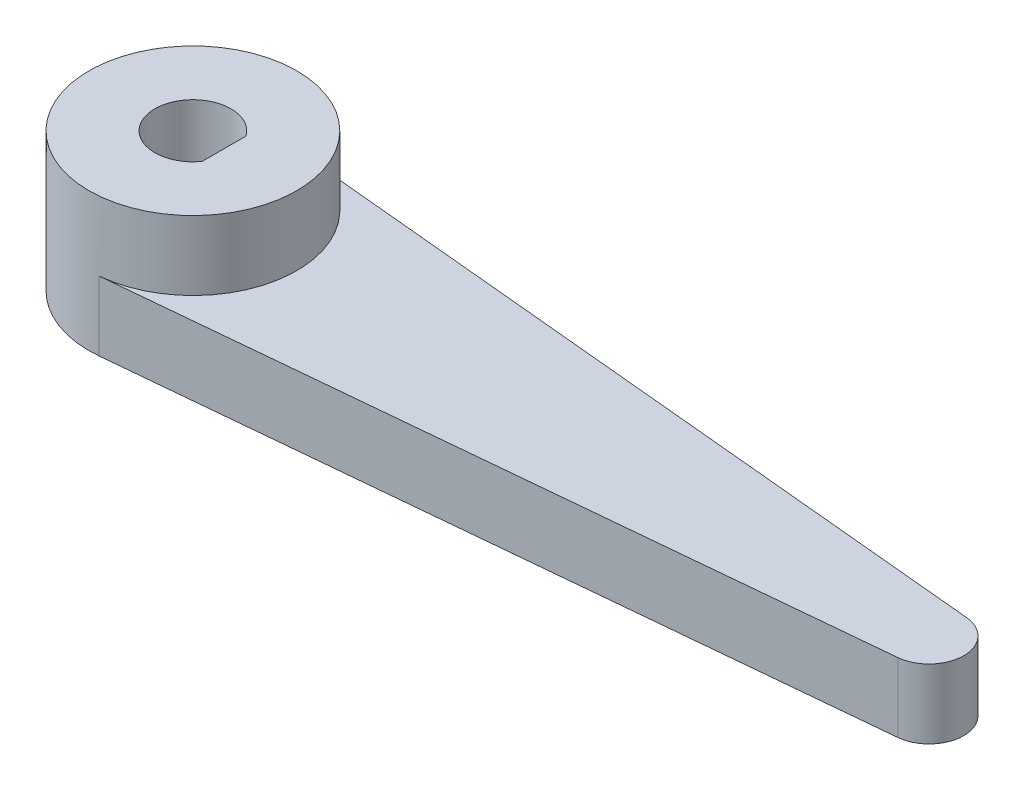
ISO-10303-21;
HEADER;
FILE_DESCRIPTION(('STEP AP214'),'2;1');
FILE_NAME('part.step','',(''),(''),'','','');
FILE_SCHEMA(('AUTOMOTIVE_DESIGN { 1 0 10303 214 1 1 1 1 }'));
ENDSEC;
DATA;
#1=APPLICATION_CONTEXT('core data for automotive mechanical design processes');
#2=APPLICATION_PROTOCOL_DEFINITION('international standard','automotive_design',2000,#1);
#3=PRODUCT_CONTEXT('',#1,'mechanical');
#4=PRODUCT('Part','Part','',(#3));
#5=PRODUCT_RELATED_PRODUCT_CATEGORY('part','',(#4));
#6=PRODUCT_DEFINITION_FORMATION('','',#4);
#7=PRODUCT_DEFINITION_CONTEXT('part definition',#1,'design');
#8=PRODUCT_DEFINITION('design','',#6,#7);
#9=PRODUCT_DEFINITION_SHAPE('','',#8);
#10=(LENGTH_UNIT() NAMED_UNIT(*) SI_UNIT(.MILLI.,.METRE.));
#11=(NAMED_UNIT(*) PLANE_ANGLE_UNIT() SI_UNIT($,.RADIAN.));
#12=(NAMED_UNIT(*) SI_UNIT($,.STERADIAN.) SOLID_ANGLE_UNIT());
#13=UNCERTAINTY_MEASURE_WITH_UNIT(LENGTH_MEASURE(1.E-05),#10,'distance_accuracy_value','');
#14=(GEOMETRIC_REPRESENTATION_CONTEXT(3) GLOBAL_UNCERTAINTY_ASSIGNED_CONTEXT((#13)) GLOBAL_UNIT_ASSIGNED_CONTEXT((#10,
#11,#12)) REPRESENTATION_CONTEXT('',''));
#15=CARTESIAN_POINT('',(0.,0.,0.));
#16=DIRECTION('',(0.,0.,1.));
#17=DIRECTION('',(1.,0.,0.));
#18=AXIS2_PLACEMENT_3D('',#15,#16,#17);
#19=CARTESIAN_POINT('',(0.,5.,0.));
#20=DIRECTION('',(0.,-1.,0.));
#21=DIRECTION('',(0.,0.,-1.));
#22=AXIS2_PLACEMENT_3D('',#19,#20,#21);
#23=CYLINDRICAL_SURFACE('',#22,7.5);
#24=CARTESIAN_POINT('',(0.,0.,0.));
#25=DIRECTION('',(0.,1.,0.));
#26=DIRECTION('',(0.,0.,1.));
#27=AXIS2_PLACEMENT_3D('',#24,#25,#26);
#28=CIRCLE('',#27,7.5);
#29=CARTESIAN_POINT('',(0.705615188968486,0.,-7.46673336909099));
#30=VERTEX_POINT('',#29);
#31=CARTESIAN_POINT('',(0.705615188968486,0.,7.46673336909099));
#32=VERTEX_POINT('',#31);
#33=EDGE_CURVE('E108',#30,#32,#28,.T.);
#34=ORIENTED_EDGE('',*,*,#33,.T.);
#35=DIRECTION('',(0.,-1.,0.));
#36=VECTOR('',#35,1.);
#37=CARTESIAN_POINT('',(0.705615188968486,5.,7.46673336909099));
#38=LINE('',#37,#36);
#39=CARTESIAN_POINT('',(0.705615188968486,5.,7.466733369091));
#40=VERTEX_POINT('',#39);
#41=EDGE_CURVE('E11',#40,#32,#38,.T.);
#42=ORIENTED_EDGE('',*,*,#41,.F.);
#43=CARTESIAN_POINT('',(0.,5.,0.));
#44=DIRECTION('',(0.,1.,0.));
#45=DIRECTION('',(0.,0.,1.));
#46=AXIS2_PLACEMENT_3D('',#43,#44,#45);
#47=CIRCLE('',#46,7.5);
#48=CARTESIAN_POINT('',(0.705615188968486,5.,-7.46673336909099));
#49=VERTEX_POINT('',#48);
#50=EDGE_CURVE('E103',#40,#49,#47,.T.);
#51=ORIENTED_EDGE('',*,*,#50,.T.);
#52=DIRECTION('',(0.,-1.,0.));
#53=VECTOR('',#52,1.);
#54=CARTESIAN_POINT('',(0.705615188968486,5.,-7.46673336909099));
#55=LINE('',#54,#53);
#56=EDGE_CURVE('E118',#49,#30,#55,.T.);
#57=ORIENTED_EDGE('',*,*,#56,.T.);
#58=EDGE_LOOP('',(#34,#42,#51,#57));
#59=FACE_BOUND('',#58,.T.);
#60=CARTESIAN_POINT('',(0.,10.,0.));
#61=DIRECTION('',(0.,1.,0.));
#62=DIRECTION('',(0.,0.,1.));
#63=AXIS2_PLACEMENT_3D('',#60,#61,#62);
#64=CIRCLE('',#63,7.5);
#65=CARTESIAN_POINT('',(0.,10.,7.5));
#66=VERTEX_POINT('',#65);
#67=EDGE_CURVE('E105',#66,#66,#64,.T.);
#68=ORIENTED_EDGE('',*,*,#67,.F.);
#69=EDGE_LOOP('',(#68));
#70=FACE_BOUND('',#69,.T.);
#71=ADVANCED_FACE('F35',(#59,#70),#23,.T.);
#72=CARTESIAN_POINT('',(0.705615188968486,5.,7.46673336909099));
#73=DIRECTION('',(-0.0940820251957981,0.,-0.995564449212133));
#74=DIRECTION('',(-0.995564449212133,0.,0.0940820251957981));
#75=AXIS2_PLACEMENT_3D('',#72,#73,#74);
#76=PLANE('',#75);
#77=DIRECTION('',(0.995564449212133,0.,-0.0940820251957981));
#78=VECTOR('',#77,1.);
#79=CARTESIAN_POINT('',(0.705615188968486,0.,7.46673336909099));
#80=LINE('',#79,#78);
#81=CARTESIAN_POINT('',(53.3803195478689,0.,2.48891112303033));
#82=VERTEX_POINT('',#81);
#83=EDGE_CURVE('E121',#32,#82,#80,.T.);
#84=ORIENTED_EDGE('',*,*,#83,.T.);
#85=DIRECTION('',(0.,-1.,0.));
#86=VECTOR('',#85,1.);
#87=CARTESIAN_POINT('',(53.3803195478689,5.,2.48891112303033));
#88=LINE('',#87,#86);
#89=CARTESIAN_POINT('',(53.3803195478689,5.,2.48891112303033));
#90=VERTEX_POINT('',#89);
#91=EDGE_CURVE('E42',#90,#82,#88,.T.);
#92=ORIENTED_EDGE('',*,*,#91,.F.);
#93=DIRECTION('',(0.995564449212133,0.,-0.0940820251957981));
#94=VECTOR('',#93,1.);
#95=CARTESIAN_POINT('',(0.705615188968486,5.,7.46673336909099));
#96=LINE('',#95,#94);
#97=EDGE_CURVE('E111',#40,#90,#96,.T.);
#98=ORIENTED_EDGE('',*,*,#97,.F.);
#99=ORIENTED_EDGE('',*,*,#41,.T.);
#100=EDGE_LOOP('',(#84,#92,#98,#99));
#101=FACE_BOUND('',#100,.T.);
#102=ADVANCED_FACE('F150',(#101),#76,.F.);
#103=CARTESIAN_POINT('',(53.1451144848794,5.,0.));
#104=DIRECTION('',(0.,-1.,0.));
#105=DIRECTION('',(0.,0.,-1.));
#106=AXIS2_PLACEMENT_3D('',#103,#104,#105);
#107=CYLINDRICAL_SURFACE('',#106,2.5);
#108=CARTESIAN_POINT('',(53.1451144848794,0.,0.));
#109=DIRECTION('',(0.,1.,0.));
#110=DIRECTION('',(0.,0.,1.));
#111=AXIS2_PLACEMENT_3D('',#108,#109,#110);
#112=CIRCLE('',#111,2.5);
#113=CARTESIAN_POINT('',(53.3803195478689,0.,-2.48891112303033));
#114=VERTEX_POINT('',#113);
#115=EDGE_CURVE('E123',#82,#114,#112,.T.);
#116=ORIENTED_EDGE('',*,*,#115,.T.);
#117=DIRECTION('',(0.,-1.,0.));
#118=VECTOR('',#117,1.);
#119=CARTESIAN_POINT('',(53.3803195478689,5.,-2.48891112303033));
#120=LINE('',#119,#118);
#121=CARTESIAN_POINT('',(53.3803195478689,5.,-2.48891112303033));
#122=VERTEX_POINT('',#121);
#123=EDGE_CURVE('E128',#122,#114,#120,.T.);
#124=ORIENTED_EDGE('',*,*,#123,.F.);
#125=CARTESIAN_POINT('',(53.1451144848794,5.,0.));
#126=DIRECTION('',(0.,1.,0.));
#127=DIRECTION('',(0.,0.,1.));
#128=AXIS2_PLACEMENT_3D('',#125,#126,#127);
#129=CIRCLE('',#128,2.5);
#130=EDGE_CURVE('E113',#90,#122,#129,.T.);
#131=ORIENTED_EDGE('',*,*,#130,.F.);
#132=ORIENTED_EDGE('',*,*,#91,.T.);
#133=EDGE_LOOP('',(#116,#124,#131,#132));
#134=FACE_BOUND('',#133,.T.);
#135=ADVANCED_FACE('F135',(#134),#107,.T.);
#136=CARTESIAN_POINT('',(0.705615188968486,5.,-7.46673336909099));
#137=DIRECTION('',(-0.0940820251957982,0.,0.995564449212133));
#138=DIRECTION('',(0.995564449212133,0.,0.0940820251957982));
#139=AXIS2_PLACEMENT_3D('',#136,#137,#138);
#140=PLANE('',#139);
#141=DIRECTION('',(-0.995564449212133,0.,-0.0940820251957982));
#142=VECTOR('',#141,1.);
#143=CARTESIAN_POINT('',(0.705615188968486,0.,-7.46673336909099));
#144=LINE('',#143,#142);
#145=EDGE_CURVE('E114',#114,#30,#144,.T.);
#146=ORIENTED_EDGE('',*,*,#145,.T.);
#147=ORIENTED_EDGE('',*,*,#56,.F.);
#148=DIRECTION('',(-0.995564449212133,0.,-0.0940820251957982));
#149=VECTOR('',#148,1.);
#150=CARTESIAN_POINT('',(0.705615188968486,5.,-7.46673336909099));
#151=LINE('',#150,#149);
#152=EDGE_CURVE('E116',#122,#49,#151,.T.);
#153=ORIENTED_EDGE('',*,*,#152,.F.);
#154=ORIENTED_EDGE('',*,*,#123,.T.);
#155=EDGE_LOOP('',(#146,#147,#153,#154));
#156=FACE_BOUND('',#155,.T.);
#157=ADVANCED_FACE('F143',(#156),#140,.F.);
#158=CARTESIAN_POINT('',(0.,5.,0.));
#159=DIRECTION('',(0.,1.,0.));
#160=DIRECTION('',(0.,0.,1.));
#161=AXIS2_PLACEMENT_3D('',#158,#159,#160);
#162=PLANE('',#161);
#163=ORIENTED_EDGE('',*,*,#50,.F.);
#164=ORIENTED_EDGE('',*,*,#97,.T.);
#165=ORIENTED_EDGE('',*,*,#130,.T.);
#166=ORIENTED_EDGE('',*,*,#152,.T.);
#167=EDGE_LOOP('',(#163,#164,#165,#166));
#168=FACE_BOUND('',#167,.T.);
#169=ADVANCED_FACE('F149',(#168),#162,.T.);
#170=CARTESIAN_POINT('',(0.,0.,0.));
#171=DIRECTION('',(0.,1.,0.));
#172=DIRECTION('',(0.,0.,1.));
#173=AXIS2_PLACEMENT_3D('',#170,#171,#172);
#174=PLANE('',#173);
#175=DIRECTION('',(0.,0.,-1.));
#176=VECTOR('',#175,1.);
#177=CARTESIAN_POINT('',(2.25,0.,-1.58113883008419));
#178=LINE('',#177,#176);
#179=CARTESIAN_POINT('',(2.25,0.,1.58113883008419));
#180=VERTEX_POINT('',#179);
#181=CARTESIAN_POINT('',(2.25,0.,-1.58113883008419));
#182=VERTEX_POINT('',#181);
#183=EDGE_CURVE('E90',#180,#182,#178,.T.);
#184=ORIENTED_EDGE('',*,*,#183,.T.);
#185=CARTESIAN_POINT('',(0.,0.,0.));
#186=DIRECTION('',(0.,1.,0.));
#187=DIRECTION('',(0.,0.,1.));
#188=AXIS2_PLACEMENT_3D('',#185,#186,#187);
#189=CIRCLE('',#188,2.75);
#190=EDGE_CURVE('E49',#182,#180,#189,.T.);
#191=ORIENTED_EDGE('',*,*,#190,.T.);
#192=EDGE_LOOP('',(#184,#191));
#193=FACE_BOUND('',#192,.T.);
#194=ORIENTED_EDGE('',*,*,#33,.F.);
#195=ORIENTED_EDGE('',*,*,#145,.F.);
#196=ORIENTED_EDGE('',*,*,#115,.F.);
#197=ORIENTED_EDGE('',*,*,#83,.F.);
#198=EDGE_LOOP('',(#194,#195,#196,#197));
#199=FACE_BOUND('',#198,.T.);
#200=ADVANCED_FACE('F96',(#193,#199),#174,.F.);
#201=CARTESIAN_POINT('',(0.,10.,0.));
#202=DIRECTION('',(0.,1.,0.));
#203=DIRECTION('',(0.,0.,1.));
#204=AXIS2_PLACEMENT_3D('',#201,#202,#203);
#205=PLANE('',#204);
#206=CARTESIAN_POINT('',(0.,10.,0.));
#207=DIRECTION('',(0.,1.,0.));
#208=DIRECTION('',(0.,0.,1.));
#209=AXIS2_PLACEMENT_3D('',#206,#207,#208);
#210=CIRCLE('',#209,2.75);
#211=CARTESIAN_POINT('',(2.25,10.,-1.58113883008419));
#212=VERTEX_POINT('',#211);
#213=CARTESIAN_POINT('',(2.25,10.,1.58113883008419));
#214=VERTEX_POINT('',#213);
#215=EDGE_CURVE('E54',#212,#214,#210,.T.);
#216=ORIENTED_EDGE('',*,*,#215,.F.);
#217=DIRECTION('',(0.,0.,-1.));
#218=VECTOR('',#217,1.);
#219=CARTESIAN_POINT('',(2.25,10.,-1.58113883008419));
#220=LINE('',#219,#218);
#221=EDGE_CURVE('E98',#214,#212,#220,.T.);
#222=ORIENTED_EDGE('',*,*,#221,.F.);
#223=EDGE_LOOP('',(#216,#222));
#224=FACE_BOUND('',#223,.T.);
#225=ORIENTED_EDGE('',*,*,#67,.T.);
#226=EDGE_LOOP('',(#225));
#227=FACE_BOUND('',#226,.T.);
#228=ADVANCED_FACE('F162',(#224,#227),#205,.T.);
#229=CARTESIAN_POINT('',(0.,0.,0.));
#230=DIRECTION('',(0.,1.,0.));
#231=DIRECTION('',(0.,0.,1.));
#232=AXIS2_PLACEMENT_3D('',#229,#230,#231);
#233=CYLINDRICAL_SURFACE('',#232,2.75);
#234=ORIENTED_EDGE('',*,*,#215,.T.);
#235=DIRECTION('',(0.,1.,0.));
#236=VECTOR('',#235,1.);
#237=CARTESIAN_POINT('',(2.25,0.,1.58113883008419));
#238=LINE('',#237,#236);
#239=EDGE_CURVE('E83',#180,#214,#238,.T.);
#240=ORIENTED_EDGE('',*,*,#239,.F.);
#241=ORIENTED_EDGE('',*,*,#190,.F.);
#242=DIRECTION('',(0.,1.,0.));
#243=VECTOR('',#242,1.);
#244=CARTESIAN_POINT('',(2.25,0.,-1.58113883008419));
#245=LINE('',#244,#243);
#246=EDGE_CURVE('E89',#182,#212,#245,.T.);
#247=ORIENTED_EDGE('',*,*,#246,.T.);
#248=EDGE_LOOP('',(#234,#240,#241,#247));
#249=FACE_BOUND('',#248,.T.);
#250=ADVANCED_FACE('F85',(#249),#233,.F.);
#251=CARTESIAN_POINT('',(2.25,0.,-1.58113883008419));
#252=DIRECTION('',(1.,0.,0.));
#253=DIRECTION('',(0.,0.,-1.));
#254=AXIS2_PLACEMENT_3D('',#251,#252,#253);
#255=PLANE('',#254);
#256=ORIENTED_EDGE('',*,*,#221,.T.);
#257=ORIENTED_EDGE('',*,*,#246,.F.);
#258=ORIENTED_EDGE('',*,*,#183,.F.);
#259=ORIENTED_EDGE('',*,*,#239,.T.);
#260=EDGE_LOOP('',(#256,#257,#258,#259));
#261=FACE_BOUND('',#260,.T.);
#262=ADVANCED_FACE('F93',(#261),#255,.F.);
#263=CLOSED_SHELL('',(#71,#102,#135,#157,#169,#200,#228,#250,#262));
#264=MANIFOLD_SOLID_BREP('B2',#263);
#265=ADVANCED_BREP_SHAPE_REPRESENTATION('',(#18,#264),#14);
#266=SHAPE_DEFINITION_REPRESENTATION(#9,#265);
ENDSEC;
END-ISO-10303-21;
